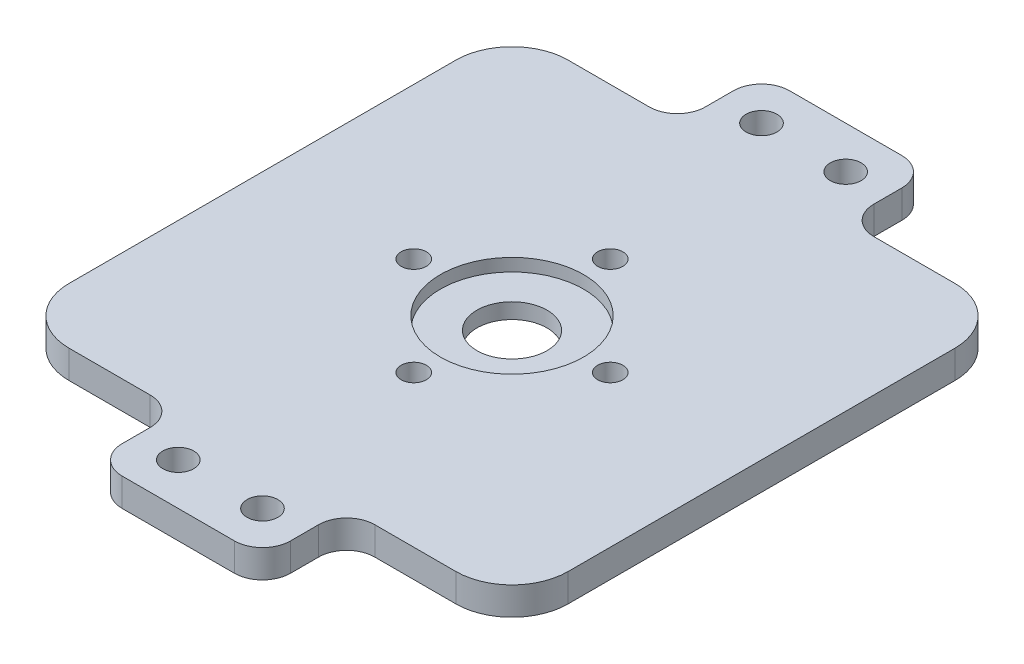
ISO-10303-21;
HEADER;
FILE_DESCRIPTION(('STEP AP214'),'2;1');
FILE_NAME('part.step','',(''),(''),'','','');
FILE_SCHEMA(('AUTOMOTIVE_DESIGN { 1 0 10303 214 1 1 1 1 }'));
ENDSEC;
DATA;
#1=APPLICATION_CONTEXT('core data for automotive mechanical design processes');
#2=APPLICATION_PROTOCOL_DEFINITION('international standard','automotive_design',2000,#1);
#3=PRODUCT_CONTEXT('',#1,'mechanical');
#4=PRODUCT('Part','Part','',(#3));
#5=PRODUCT_RELATED_PRODUCT_CATEGORY('part','',(#4));
#6=PRODUCT_DEFINITION_FORMATION('','',#4);
#7=PRODUCT_DEFINITION_CONTEXT('part definition',#1,'design');
#8=PRODUCT_DEFINITION('design','',#6,#7);
#9=PRODUCT_DEFINITION_SHAPE('','',#8);
#10=(LENGTH_UNIT() NAMED_UNIT(*) SI_UNIT(.MILLI.,.METRE.));
#11=(NAMED_UNIT(*) PLANE_ANGLE_UNIT() SI_UNIT($,.RADIAN.));
#12=(NAMED_UNIT(*) SI_UNIT($,.STERADIAN.) SOLID_ANGLE_UNIT());
#13=UNCERTAINTY_MEASURE_WITH_UNIT(LENGTH_MEASURE(1.E-05),#10,'distance_accuracy_value','');
#14=(GEOMETRIC_REPRESENTATION_CONTEXT(3) GLOBAL_UNCERTAINTY_ASSIGNED_CONTEXT((#13)) GLOBAL_UNIT_ASSIGNED_CONTEXT((#10,
#11,#12)) REPRESENTATION_CONTEXT('',''));
#15=CARTESIAN_POINT('',(0.,0.,0.));
#16=DIRECTION('',(0.,0.,1.));
#17=DIRECTION('',(1.,0.,0.));
#18=AXIS2_PLACEMENT_3D('',#15,#16,#17);
#19=CARTESIAN_POINT('',(44.45,5.,-44.45));
#20=DIRECTION('',(0.,-1.,0.));
#21=DIRECTION('',(0.,0.,-1.));
#22=AXIS2_PLACEMENT_3D('',#19,#20,#21);
#23=CYLINDRICAL_SURFACE('',#22,6.25);
#24=CARTESIAN_POINT('',(44.45,0.,-44.45));
#25=DIRECTION('',(0.,1.,0.));
#26=DIRECTION('',(0.,0.,1.));
#27=AXIS2_PLACEMENT_3D('',#24,#25,#26);
#28=CIRCLE('',#27,6.25);
#29=CARTESIAN_POINT('',(44.45,0.,-38.2));
#30=VERTEX_POINT('',#29);
#31=EDGE_CURVE('E251',#30,#30,#28,.T.);
#32=ORIENTED_EDGE('',*,*,#31,.F.);
#33=EDGE_LOOP('',(#32));
#34=FACE_BOUND('',#33,.T.);
#35=CARTESIAN_POINT('',(44.45,2.75,-44.45));
#36=DIRECTION('',(0.,1.,0.));
#37=DIRECTION('',(0.,0.,1.));
#38=AXIS2_PLACEMENT_3D('',#35,#36,#37);
#39=CIRCLE('',#38,6.25);
#40=CARTESIAN_POINT('',(44.45,2.75,-38.2));
#41=VERTEX_POINT('',#40);
#42=EDGE_CURVE('E49',#41,#41,#39,.T.);
#43=ORIENTED_EDGE('',*,*,#42,.T.);
#44=EDGE_LOOP('',(#43));
#45=FACE_BOUND('',#44,.T.);
#46=ADVANCED_FACE('F45',(#34,#45),#23,.F.);
#47=CARTESIAN_POINT('',(0.,5.,15.));
#48=DIRECTION('',(0.,0.,1.));
#49=DIRECTION('',(1.,0.,0.));
#50=AXIS2_PLACEMENT_3D('',#47,#48,#49);
#51=PLANE('',#50);
#52=DIRECTION('',(-1.,0.,0.));
#53=VECTOR('',#52,1.);
#54=CARTESIAN_POINT('',(0.,5.,15.));
#55=LINE('',#54,#53);
#56=CARTESIAN_POINT('',(54.45,5.,15.));
#57=VERTEX_POINT('',#56);
#58=CARTESIAN_POINT('',(34.45,5.,15.));
#59=VERTEX_POINT('',#58);
#60=EDGE_CURVE('E420',#57,#59,#55,.T.);
#61=ORIENTED_EDGE('',*,*,#60,.T.);
#62=DIRECTION('',(0.,-1.,0.));
#63=VECTOR('',#62,1.);
#64=CARTESIAN_POINT('',(34.45,0.,15.));
#65=LINE('',#64,#63);
#66=CARTESIAN_POINT('',(34.45,0.,15.));
#67=VERTEX_POINT('',#66);
#68=EDGE_CURVE('E348',#59,#67,#65,.T.);
#69=ORIENTED_EDGE('',*,*,#68,.T.);
#70=DIRECTION('',(-1.,0.,0.));
#71=VECTOR('',#70,1.);
#72=CARTESIAN_POINT('',(0.,0.,15.));
#73=LINE('',#72,#71);
#74=CARTESIAN_POINT('',(54.45,0.,15.));
#75=VERTEX_POINT('',#74);
#76=EDGE_CURVE('E403',#75,#67,#73,.T.);
#77=ORIENTED_EDGE('',*,*,#76,.F.);
#78=DIRECTION('',(0.,-1.,0.));
#79=VECTOR('',#78,1.);
#80=CARTESIAN_POINT('',(54.45,5.,15.));
#81=LINE('',#80,#79);
#82=EDGE_CURVE('E345',#75,#57,#81,.F.);
#83=ORIENTED_EDGE('',*,*,#82,.T.);
#84=EDGE_LOOP('',(#61,#69,#77,#83));
#85=FACE_BOUND('',#84,.T.);
#86=ADVANCED_FACE('F564',(#85),#51,.T.);
#87=CARTESIAN_POINT('',(59.45,5.,0.));
#88=DIRECTION('',(1.,0.,0.));
#89=DIRECTION('',(0.,0.,-1.));
#90=AXIS2_PLACEMENT_3D('',#87,#88,#89);
#91=PLANE('',#90);
#92=DIRECTION('',(0.,0.,1.));
#93=VECTOR('',#92,1.);
#94=CARTESIAN_POINT('',(59.45,0.,0.));
#95=LINE('',#94,#93);
#96=CARTESIAN_POINT('',(59.45,0.,5.));
#97=VERTEX_POINT('',#96);
#98=CARTESIAN_POINT('',(59.45,0.,10.));
#99=VERTEX_POINT('',#98);
#100=EDGE_CURVE('E394',#97,#99,#95,.T.);
#101=ORIENTED_EDGE('',*,*,#100,.F.);
#102=DIRECTION('',(0.,-1.,0.));
#103=VECTOR('',#102,1.);
#104=CARTESIAN_POINT('',(59.45,5.,5.));
#105=LINE('',#104,#103);
#106=CARTESIAN_POINT('',(59.45,5.,5.));
#107=VERTEX_POINT('',#106);
#108=EDGE_CURVE('E370',#97,#107,#105,.F.);
#109=ORIENTED_EDGE('',*,*,#108,.T.);
#110=DIRECTION('',(0.,0.,1.));
#111=VECTOR('',#110,1.);
#112=CARTESIAN_POINT('',(59.45,5.,0.));
#113=LINE('',#112,#111);
#114=CARTESIAN_POINT('',(59.45,5.,10.));
#115=VERTEX_POINT('',#114);
#116=EDGE_CURVE('E413',#107,#115,#113,.T.);
#117=ORIENTED_EDGE('',*,*,#116,.T.);
#118=DIRECTION('',(0.,-1.,0.));
#119=VECTOR('',#118,1.);
#120=CARTESIAN_POINT('',(59.45,5.,10.));
#121=LINE('',#120,#119);
#122=EDGE_CURVE('E366',#115,#99,#121,.T.);
#123=ORIENTED_EDGE('',*,*,#122,.T.);
#124=EDGE_LOOP('',(#101,#109,#117,#123));
#125=FACE_BOUND('',#124,.T.);
#126=ADVANCED_FACE('F400',(#125),#91,.T.);
#127=CARTESIAN_POINT('',(0.,5.,0.));
#128=DIRECTION('',(0.,0.,-1.));
#129=DIRECTION('',(-1.,0.,0.));
#130=AXIS2_PLACEMENT_3D('',#127,#128,#129);
#131=PLANE('',#130);
#132=DIRECTION('',(1.,0.,0.));
#133=VECTOR('',#132,1.);
#134=CARTESIAN_POINT('',(0.,5.,0.));
#135=LINE('',#134,#133);
#136=CARTESIAN_POINT('',(64.45,5.,0.));
#137=VERTEX_POINT('',#136);
#138=CARTESIAN_POINT('',(78.9,5.,0.));
#139=VERTEX_POINT('',#138);
#140=EDGE_CURVE('E408',#137,#139,#135,.T.);
#141=ORIENTED_EDGE('',*,*,#140,.F.);
#142=DIRECTION('',(0.,-1.,0.));
#143=VECTOR('',#142,1.);
#144=CARTESIAN_POINT('',(64.45,5.,0.));
#145=LINE('',#144,#143);
#146=CARTESIAN_POINT('',(64.45,0.,0.));
#147=VERTEX_POINT('',#146);
#148=EDGE_CURVE('E362',#137,#147,#145,.T.);
#149=ORIENTED_EDGE('',*,*,#148,.T.);
#150=DIRECTION('',(1.,0.,0.));
#151=VECTOR('',#150,1.);
#152=CARTESIAN_POINT('',(0.,0.,0.));
#153=LINE('',#152,#151);
#154=CARTESIAN_POINT('',(78.9,0.,0.));
#155=VERTEX_POINT('',#154);
#156=EDGE_CURVE('E395',#147,#155,#153,.T.);
#157=ORIENTED_EDGE('',*,*,#156,.T.);
#158=DIRECTION('',(0.,-1.,0.));
#159=VECTOR('',#158,1.);
#160=CARTESIAN_POINT('',(78.9,5.,0.));
#161=LINE('',#160,#159);
#162=EDGE_CURVE('E276',#155,#139,#161,.F.);
#163=ORIENTED_EDGE('',*,*,#162,.T.);
#164=EDGE_LOOP('',(#141,#149,#157,#163));
#165=FACE_BOUND('',#164,.T.);
#166=ADVANCED_FACE('F407',(#165),#131,.F.);
#167=CARTESIAN_POINT('',(88.9,5.,0.));
#168=DIRECTION('',(-1.,0.,0.));
#169=DIRECTION('',(0.,0.,1.));
#170=AXIS2_PLACEMENT_3D('',#167,#168,#169);
#171=PLANE('',#170);
#172=DIRECTION('',(0.,0.,-1.));
#173=VECTOR('',#172,1.);
#174=CARTESIAN_POINT('',(88.9,0.,0.));
#175=LINE('',#174,#173);
#176=CARTESIAN_POINT('',(88.9,0.,-10.));
#177=VERTEX_POINT('',#176);
#178=CARTESIAN_POINT('',(88.9,0.,-78.9));
#179=VERTEX_POINT('',#178);
#180=EDGE_CURVE('E221',#177,#179,#175,.T.);
#181=ORIENTED_EDGE('',*,*,#180,.T.);
#182=DIRECTION('',(0.,-1.,0.));
#183=VECTOR('',#182,1.);
#184=CARTESIAN_POINT('',(88.9,5.,-78.9));
#185=LINE('',#184,#183);
#186=CARTESIAN_POINT('',(88.9,5.,-78.9));
#187=VERTEX_POINT('',#186);
#188=EDGE_CURVE('E230',#179,#187,#185,.F.);
#189=ORIENTED_EDGE('',*,*,#188,.T.);
#190=DIRECTION('',(0.,0.,-1.));
#191=VECTOR('',#190,1.);
#192=CARTESIAN_POINT('',(88.9,5.,0.));
#193=LINE('',#192,#191);
#194=CARTESIAN_POINT('',(88.9,5.,-10.));
#195=VERTEX_POINT('',#194);
#196=EDGE_CURVE('E412',#195,#187,#193,.T.);
#197=ORIENTED_EDGE('',*,*,#196,.F.);
#198=DIRECTION('',(0.,-1.,0.));
#199=VECTOR('',#198,1.);
#200=CARTESIAN_POINT('',(88.9,5.,-10.));
#201=LINE('',#200,#199);
#202=EDGE_CURVE('E232',#195,#177,#201,.T.);
#203=ORIENTED_EDGE('',*,*,#202,.T.);
#204=EDGE_LOOP('',(#181,#189,#197,#203));
#205=FACE_BOUND('',#204,.T.);
#206=ADVANCED_FACE('F636',(#205),#171,.F.);
#207=CARTESIAN_POINT('',(0.,5.,-88.9));
#208=DIRECTION('',(0.,0.,-1.));
#209=DIRECTION('',(-1.,0.,0.));
#210=AXIS2_PLACEMENT_3D('',#207,#208,#209);
#211=PLANE('',#210);
#212=DIRECTION('',(1.,0.,0.));
#213=VECTOR('',#212,1.);
#214=CARTESIAN_POINT('',(0.,0.,-88.9));
#215=LINE('',#214,#213);
#216=CARTESIAN_POINT('',(64.45,0.,-88.9));
#217=VERTEX_POINT('',#216);
#218=CARTESIAN_POINT('',(78.9,0.,-88.9));
#219=VERTEX_POINT('',#218);
#220=EDGE_CURVE('E206',#217,#219,#215,.T.);
#221=ORIENTED_EDGE('',*,*,#220,.F.);
#222=DIRECTION('',(0.,-1.,0.));
#223=VECTOR('',#222,1.);
#224=CARTESIAN_POINT('',(64.45,5.,-88.9));
#225=LINE('',#224,#223);
#226=CARTESIAN_POINT('',(64.45,5.,-88.9));
#227=VERTEX_POINT('',#226);
#228=EDGE_CURVE('E342',#217,#227,#225,.F.);
#229=ORIENTED_EDGE('',*,*,#228,.T.);
#230=DIRECTION('',(1.,0.,0.));
#231=VECTOR('',#230,1.);
#232=CARTESIAN_POINT('',(0.,5.,-88.9));
#233=LINE('',#232,#231);
#234=CARTESIAN_POINT('',(78.9,5.,-88.9));
#235=VERTEX_POINT('',#234);
#236=EDGE_CURVE('E237',#227,#235,#233,.T.);
#237=ORIENTED_EDGE('',*,*,#236,.T.);
#238=DIRECTION('',(0.,-1.,0.));
#239=VECTOR('',#238,1.);
#240=CARTESIAN_POINT('',(78.9,0.,-88.9));
#241=LINE('',#240,#239);
#242=EDGE_CURVE('E229',#235,#219,#241,.T.);
#243=ORIENTED_EDGE('',*,*,#242,.T.);
#244=EDGE_LOOP('',(#221,#229,#237,#243));
#245=FACE_BOUND('',#244,.T.);
#246=ADVANCED_FACE('F235',(#245),#211,.T.);
#247=CARTESIAN_POINT('',(59.45,5.,0.));
#248=DIRECTION('',(-1.,0.,0.));
#249=DIRECTION('',(0.,0.,1.));
#250=AXIS2_PLACEMENT_3D('',#247,#248,#249);
#251=PLANE('',#250);
#252=DIRECTION('',(0.,0.,-1.));
#253=VECTOR('',#252,1.);
#254=CARTESIAN_POINT('',(59.45,0.,0.));
#255=LINE('',#254,#253);
#256=CARTESIAN_POINT('',(59.45,0.,-93.9));
#257=VERTEX_POINT('',#256);
#258=CARTESIAN_POINT('',(59.45,0.,-98.9));
#259=VERTEX_POINT('',#258);
#260=EDGE_CURVE('E220',#257,#259,#255,.T.);
#261=ORIENTED_EDGE('',*,*,#260,.T.);
#262=DIRECTION('',(0.,-1.,0.));
#263=VECTOR('',#262,1.);
#264=CARTESIAN_POINT('',(59.45,5.,-98.9));
#265=LINE('',#264,#263);
#266=CARTESIAN_POINT('',(59.45,5.,-98.9));
#267=VERTEX_POINT('',#266);
#268=EDGE_CURVE('E339',#259,#267,#265,.F.);
#269=ORIENTED_EDGE('',*,*,#268,.T.);
#270=DIRECTION('',(0.,0.,-1.));
#271=VECTOR('',#270,1.);
#272=CARTESIAN_POINT('',(59.45,5.,0.));
#273=LINE('',#272,#271);
#274=CARTESIAN_POINT('',(59.45,5.,-93.9));
#275=VERTEX_POINT('',#274);
#276=EDGE_CURVE('E717',#275,#267,#273,.T.);
#277=ORIENTED_EDGE('',*,*,#276,.F.);
#278=DIRECTION('',(0.,-1.,0.));
#279=VECTOR('',#278,1.);
#280=CARTESIAN_POINT('',(59.45,5.,-93.9));
#281=LINE('',#280,#279);
#282=EDGE_CURVE('E335',#275,#257,#281,.T.);
#283=ORIENTED_EDGE('',*,*,#282,.T.);
#284=EDGE_LOOP('',(#261,#269,#277,#283));
#285=FACE_BOUND('',#284,.T.);
#286=ADVANCED_FACE('F631',(#285),#251,.F.);
#287=CARTESIAN_POINT('',(0.,5.,-103.9));
#288=DIRECTION('',(0.,0.,1.));
#289=DIRECTION('',(1.,0.,0.));
#290=AXIS2_PLACEMENT_3D('',#287,#288,#289);
#291=PLANE('',#290);
#292=DIRECTION('',(-1.,0.,0.));
#293=VECTOR('',#292,1.);
#294=CARTESIAN_POINT('',(0.,0.,-103.9));
#295=LINE('',#294,#293);
#296=CARTESIAN_POINT('',(54.45,0.,-103.9));
#297=VERTEX_POINT('',#296);
#298=CARTESIAN_POINT('',(34.45,0.,-103.9));
#299=VERTEX_POINT('',#298);
#300=EDGE_CURVE('E483',#297,#299,#295,.T.);
#301=ORIENTED_EDGE('',*,*,#300,.T.);
#302=DIRECTION('',(0.,-1.,0.));
#303=VECTOR('',#302,1.);
#304=CARTESIAN_POINT('',(34.45,5.,-103.9));
#305=LINE('',#304,#303);
#306=CARTESIAN_POINT('',(34.45,5.,-103.9));
#307=VERTEX_POINT('',#306);
#308=EDGE_CURVE('E317',#299,#307,#305,.F.);
#309=ORIENTED_EDGE('',*,*,#308,.T.);
#310=DIRECTION('',(-1.,0.,0.));
#311=VECTOR('',#310,1.);
#312=CARTESIAN_POINT('',(0.,5.,-103.9));
#313=LINE('',#312,#311);
#314=CARTESIAN_POINT('',(54.45,5.,-103.9));
#315=VERTEX_POINT('',#314);
#316=EDGE_CURVE('E715',#315,#307,#313,.T.);
#317=ORIENTED_EDGE('',*,*,#316,.F.);
#318=DIRECTION('',(0.,-1.,0.));
#319=VECTOR('',#318,1.);
#320=CARTESIAN_POINT('',(54.45,5.,-103.9));
#321=LINE('',#320,#319);
#322=EDGE_CURVE('E313',#315,#297,#321,.T.);
#323=ORIENTED_EDGE('',*,*,#322,.T.);
#324=EDGE_LOOP('',(#301,#309,#317,#323));
#325=FACE_BOUND('',#324,.T.);
#326=ADVANCED_FACE('F627',(#325),#291,.F.);
#327=CARTESIAN_POINT('',(29.45,5.,0.));
#328=DIRECTION('',(-1.,0.,0.));
#329=DIRECTION('',(0.,0.,1.));
#330=AXIS2_PLACEMENT_3D('',#327,#328,#329);
#331=PLANE('',#330);
#332=DIRECTION('',(0.,0.,-1.));
#333=VECTOR('',#332,1.);
#334=CARTESIAN_POINT('',(29.45,5.,0.));
#335=LINE('',#334,#333);
#336=CARTESIAN_POINT('',(29.45,5.,-93.9));
#337=VERTEX_POINT('',#336);
#338=CARTESIAN_POINT('',(29.45,5.,-98.9));
#339=VERTEX_POINT('',#338);
#340=EDGE_CURVE('E441',#337,#339,#335,.T.);
#341=ORIENTED_EDGE('',*,*,#340,.T.);
#342=DIRECTION('',(0.,-1.,0.));
#343=VECTOR('',#342,1.);
#344=CARTESIAN_POINT('',(29.45,0.,-98.9));
#345=LINE('',#344,#343);
#346=CARTESIAN_POINT('',(29.45,0.,-98.9));
#347=VERTEX_POINT('',#346);
#348=EDGE_CURVE('E297',#339,#347,#345,.T.);
#349=ORIENTED_EDGE('',*,*,#348,.T.);
#350=DIRECTION('',(0.,0.,-1.));
#351=VECTOR('',#350,1.);
#352=CARTESIAN_POINT('',(29.45,0.,0.));
#353=LINE('',#352,#351);
#354=CARTESIAN_POINT('',(29.45,0.,-93.9));
#355=VERTEX_POINT('',#354);
#356=EDGE_CURVE('E487',#355,#347,#353,.T.);
#357=ORIENTED_EDGE('',*,*,#356,.F.);
#358=DIRECTION('',(0.,-1.,0.));
#359=VECTOR('',#358,1.);
#360=CARTESIAN_POINT('',(29.45,5.,-93.9));
#361=LINE('',#360,#359);
#362=EDGE_CURVE('E294',#355,#337,#361,.F.);
#363=ORIENTED_EDGE('',*,*,#362,.T.);
#364=EDGE_LOOP('',(#341,#349,#357,#363));
#365=FACE_BOUND('',#364,.T.);
#366=ADVANCED_FACE('F623',(#365),#331,.T.);
#367=CARTESIAN_POINT('',(10.,5.,-88.9));
#368=VERTEX_POINT('',#367);
#369=CARTESIAN_POINT('',(24.45,5.,-88.9));
#370=VERTEX_POINT('',#369);
#371=EDGE_CURVE('E434',#368,#370,#233,.T.);
#372=ORIENTED_EDGE('',*,*,#371,.T.);
#373=DIRECTION('',(0.,-1.,0.));
#374=VECTOR('',#373,1.);
#375=CARTESIAN_POINT('',(24.45,0.,-88.9));
#376=LINE('',#375,#374);
#377=CARTESIAN_POINT('',(24.45,0.,-88.9));
#378=VERTEX_POINT('',#377);
#379=EDGE_CURVE('E331',#370,#378,#376,.T.);
#380=ORIENTED_EDGE('',*,*,#379,.T.);
#381=CARTESIAN_POINT('',(10.,0.,-88.9));
#382=VERTEX_POINT('',#381);
#383=EDGE_CURVE('E223',#382,#378,#215,.T.);
#384=ORIENTED_EDGE('',*,*,#383,.F.);
#385=DIRECTION('',(0.,-1.,0.));
#386=VECTOR('',#385,1.);
#387=CARTESIAN_POINT('',(10.,5.,-88.9));
#388=LINE('',#387,#386);
#389=EDGE_CURVE('E291',#382,#368,#388,.F.);
#390=ORIENTED_EDGE('',*,*,#389,.T.);
#391=EDGE_LOOP('',(#372,#380,#384,#390));
#392=FACE_BOUND('',#391,.T.);
#393=ADVANCED_FACE('F620',(#392),#211,.T.);
#394=CARTESIAN_POINT('',(0.,5.,0.));
#395=DIRECTION('',(-1.,0.,0.));
#396=DIRECTION('',(0.,0.,1.));
#397=AXIS2_PLACEMENT_3D('',#394,#395,#396);
#398=PLANE('',#397);
#399=DIRECTION('',(0.,0.,-1.));
#400=VECTOR('',#399,1.);
#401=CARTESIAN_POINT('',(0.,0.,0.));
#402=LINE('',#401,#400);
#403=CARTESIAN_POINT('',(0.,0.,-10.));
#404=VERTEX_POINT('',#403);
#405=CARTESIAN_POINT('',(0.,0.,-78.9));
#406=VERTEX_POINT('',#405);
#407=EDGE_CURVE('E490',#404,#406,#402,.T.);
#408=ORIENTED_EDGE('',*,*,#407,.F.);
#409=DIRECTION('',(0.,-1.,0.));
#410=VECTOR('',#409,1.);
#411=CARTESIAN_POINT('',(0.,5.,-10.));
#412=LINE('',#411,#410);
#413=CARTESIAN_POINT('',(0.,5.,-10.));
#414=VERTEX_POINT('',#413);
#415=EDGE_CURVE('E288',#404,#414,#412,.F.);
#416=ORIENTED_EDGE('',*,*,#415,.T.);
#417=DIRECTION('',(0.,0.,-1.));
#418=VECTOR('',#417,1.);
#419=CARTESIAN_POINT('',(0.,5.,0.));
#420=LINE('',#419,#418);
#421=CARTESIAN_POINT('',(0.,5.,-78.9));
#422=VERTEX_POINT('',#421);
#423=EDGE_CURVE('E425',#414,#422,#420,.T.);
#424=ORIENTED_EDGE('',*,*,#423,.T.);
#425=DIRECTION('',(0.,-1.,0.));
#426=VECTOR('',#425,1.);
#427=CARTESIAN_POINT('',(0.,5.,-78.9));
#428=LINE('',#427,#426);
#429=EDGE_CURVE('E284',#422,#406,#428,.T.);
#430=ORIENTED_EDGE('',*,*,#429,.T.);
#431=EDGE_LOOP('',(#408,#416,#424,#430));
#432=FACE_BOUND('',#431,.T.);
#433=ADVANCED_FACE('F616',(#432),#398,.T.);
#434=CARTESIAN_POINT('',(10.,0.,0.));
#435=VERTEX_POINT('',#434);
#436=CARTESIAN_POINT('',(24.45,0.,0.));
#437=VERTEX_POINT('',#436);
#438=EDGE_CURVE('E477',#435,#437,#153,.T.);
#439=ORIENTED_EDGE('',*,*,#438,.T.);
#440=DIRECTION('',(0.,-1.,0.));
#441=VECTOR('',#440,1.);
#442=CARTESIAN_POINT('',(24.45,5.,0.));
#443=LINE('',#442,#441);
#444=CARTESIAN_POINT('',(24.45,5.,0.));
#445=VERTEX_POINT('',#444);
#446=EDGE_CURVE('E359',#437,#445,#443,.F.);
#447=ORIENTED_EDGE('',*,*,#446,.T.);
#448=CARTESIAN_POINT('',(10.,5.,0.));
#449=VERTEX_POINT('',#448);
#450=EDGE_CURVE('E415',#449,#445,#135,.T.);
#451=ORIENTED_EDGE('',*,*,#450,.F.);
#452=DIRECTION('',(0.,-1.,0.));
#453=VECTOR('',#452,1.);
#454=CARTESIAN_POINT('',(10.,0.,0.));
#455=LINE('',#454,#453);
#456=EDGE_CURVE('E280',#449,#435,#455,.T.);
#457=ORIENTED_EDGE('',*,*,#456,.T.);
#458=EDGE_LOOP('',(#439,#447,#451,#457));
#459=FACE_BOUND('',#458,.T.);
#460=ADVANCED_FACE('F580',(#459),#131,.F.);
#461=CARTESIAN_POINT('',(36.95,5.,7.5));
#462=DIRECTION('',(0.,-1.,0.));
#463=DIRECTION('',(0.,0.,-1.));
#464=AXIS2_PLACEMENT_3D('',#461,#462,#463);
#465=CYLINDRICAL_SURFACE('',#464,2.75);
#466=CARTESIAN_POINT('',(36.95,5.,7.5));
#467=DIRECTION('',(0.,1.,0.));
#468=DIRECTION('',(0.,0.,1.));
#469=AXIS2_PLACEMENT_3D('',#466,#467,#468);
#470=CIRCLE('',#469,2.75);
#471=CARTESIAN_POINT('',(36.95,5.,10.25));
#472=VERTEX_POINT('',#471);
#473=EDGE_CURVE('E241',#472,#472,#470,.T.);
#474=ORIENTED_EDGE('',*,*,#473,.T.);
#475=EDGE_LOOP('',(#474));
#476=FACE_BOUND('',#475,.T.);
#477=CARTESIAN_POINT('',(36.95,0.,7.5));
#478=DIRECTION('',(0.,1.,0.));
#479=DIRECTION('',(0.,0.,1.));
#480=AXIS2_PLACEMENT_3D('',#477,#478,#479);
#481=CIRCLE('',#480,2.75);
#482=CARTESIAN_POINT('',(36.95,0.,10.25));
#483=VERTEX_POINT('',#482);
#484=EDGE_CURVE('E525',#483,#483,#481,.T.);
#485=ORIENTED_EDGE('',*,*,#484,.F.);
#486=EDGE_LOOP('',(#485));
#487=FACE_BOUND('',#486,.T.);
#488=ADVANCED_FACE('F576',(#476,#487),#465,.F.);
#489=CARTESIAN_POINT('',(51.95,5.,7.5));
#490=DIRECTION('',(0.,-1.,0.));
#491=DIRECTION('',(0.,0.,-1.));
#492=AXIS2_PLACEMENT_3D('',#489,#490,#491);
#493=CYLINDRICAL_SURFACE('',#492,2.75);
#494=CARTESIAN_POINT('',(51.95,5.,7.5));
#495=DIRECTION('',(0.,1.,0.));
#496=DIRECTION('',(0.,0.,1.));
#497=AXIS2_PLACEMENT_3D('',#494,#495,#496);
#498=CIRCLE('',#497,2.75);
#499=CARTESIAN_POINT('',(51.95,5.,10.25));
#500=VERTEX_POINT('',#499);
#501=EDGE_CURVE('E248',#500,#500,#498,.T.);
#502=ORIENTED_EDGE('',*,*,#501,.T.);
#503=EDGE_LOOP('',(#502));
#504=FACE_BOUND('',#503,.T.);
#505=CARTESIAN_POINT('',(51.95,0.,7.5));
#506=DIRECTION('',(0.,1.,0.));
#507=DIRECTION('',(0.,0.,1.));
#508=AXIS2_PLACEMENT_3D('',#505,#506,#507);
#509=CIRCLE('',#508,2.75);
#510=CARTESIAN_POINT('',(51.95,0.,10.25));
#511=VERTEX_POINT('',#510);
#512=EDGE_CURVE('E522',#511,#511,#509,.T.);
#513=ORIENTED_EDGE('',*,*,#512,.F.);
#514=EDGE_LOOP('',(#513));
#515=FACE_BOUND('',#514,.T.);
#516=ADVANCED_FACE('F579',(#504,#515),#493,.F.);
#517=CARTESIAN_POINT('',(36.95,5.,-96.4));
#518=DIRECTION('',(0.,-1.,0.));
#519=DIRECTION('',(0.,0.,-1.));
#520=AXIS2_PLACEMENT_3D('',#517,#518,#519);
#521=CYLINDRICAL_SURFACE('',#520,2.75);
#522=CARTESIAN_POINT('',(36.95,5.,-96.4));
#523=DIRECTION('',(0.,1.,0.));
#524=DIRECTION('',(0.,0.,1.));
#525=AXIS2_PLACEMENT_3D('',#522,#523,#524);
#526=CIRCLE('',#525,2.75);
#527=CARTESIAN_POINT('',(36.95,5.,-93.65));
#528=VERTEX_POINT('',#527);
#529=EDGE_CURVE('E465',#528,#528,#526,.T.);
#530=ORIENTED_EDGE('',*,*,#529,.T.);
#531=EDGE_LOOP('',(#530));
#532=FACE_BOUND('',#531,.T.);
#533=CARTESIAN_POINT('',(36.95,0.,-96.4));
#534=DIRECTION('',(0.,1.,0.));
#535=DIRECTION('',(0.,0.,1.));
#536=AXIS2_PLACEMENT_3D('',#533,#534,#535);
#537=CIRCLE('',#536,2.75);
#538=CARTESIAN_POINT('',(36.95,0.,-93.65));
#539=VERTEX_POINT('',#538);
#540=EDGE_CURVE('E518',#539,#539,#537,.T.);
#541=ORIENTED_EDGE('',*,*,#540,.F.);
#542=EDGE_LOOP('',(#541));
#543=FACE_BOUND('',#542,.T.);
#544=ADVANCED_FACE('F584',(#532,#543),#521,.F.);
#545=CARTESIAN_POINT('',(51.95,5.,-96.4));
#546=DIRECTION('',(0.,-1.,0.));
#547=DIRECTION('',(0.,0.,-1.));
#548=AXIS2_PLACEMENT_3D('',#545,#546,#547);
#549=CYLINDRICAL_SURFACE('',#548,2.75);
#550=CARTESIAN_POINT('',(51.95,5.,-96.4));
#551=DIRECTION('',(0.,1.,0.));
#552=DIRECTION('',(0.,0.,1.));
#553=AXIS2_PLACEMENT_3D('',#550,#551,#552);
#554=CIRCLE('',#553,2.75);
#555=CARTESIAN_POINT('',(51.95,5.,-93.65));
#556=VERTEX_POINT('',#555);
#557=EDGE_CURVE('E461',#556,#556,#554,.T.);
#558=ORIENTED_EDGE('',*,*,#557,.T.);
#559=EDGE_LOOP('',(#558));
#560=FACE_BOUND('',#559,.T.);
#561=CARTESIAN_POINT('',(51.95,0.,-96.4));
#562=DIRECTION('',(0.,1.,0.));
#563=DIRECTION('',(0.,0.,1.));
#564=AXIS2_PLACEMENT_3D('',#561,#562,#563);
#565=CIRCLE('',#564,2.75);
#566=CARTESIAN_POINT('',(51.95,0.,-93.65));
#567=VERTEX_POINT('',#566);
#568=EDGE_CURVE('E514',#567,#567,#565,.T.);
#569=ORIENTED_EDGE('',*,*,#568,.F.);
#570=EDGE_LOOP('',(#569));
#571=FACE_BOUND('',#570,.T.);
#572=ADVANCED_FACE('F588',(#560,#571),#549,.F.);
#573=CARTESIAN_POINT('',(61.95,5.,-44.45));
#574=DIRECTION('',(0.,-1.,0.));
#575=DIRECTION('',(0.,0.,-1.));
#576=AXIS2_PLACEMENT_3D('',#573,#574,#575);
#577=CYLINDRICAL_SURFACE('',#576,2.25);
#578=CARTESIAN_POINT('',(61.95,5.,-44.45));
#579=DIRECTION('',(0.,1.,0.));
#580=DIRECTION('',(0.,0.,1.));
#581=AXIS2_PLACEMENT_3D('',#578,#579,#580);
#582=CIRCLE('',#581,2.25);
#583=CARTESIAN_POINT('',(61.95,5.,-42.2));
#584=VERTEX_POINT('',#583);
#585=EDGE_CURVE('E457',#584,#584,#582,.T.);
#586=ORIENTED_EDGE('',*,*,#585,.T.);
#587=EDGE_LOOP('',(#586));
#588=FACE_BOUND('',#587,.T.);
#589=CARTESIAN_POINT('',(61.95,0.,-44.45));
#590=DIRECTION('',(0.,1.,0.));
#591=DIRECTION('',(0.,0.,1.));
#592=AXIS2_PLACEMENT_3D('',#589,#590,#591);
#593=CIRCLE('',#592,2.25);
#594=CARTESIAN_POINT('',(61.95,0.,-42.2));
#595=VERTEX_POINT('',#594);
#596=EDGE_CURVE('E510',#595,#595,#593,.T.);
#597=ORIENTED_EDGE('',*,*,#596,.F.);
#598=EDGE_LOOP('',(#597));
#599=FACE_BOUND('',#598,.T.);
#600=ADVANCED_FACE('F592',(#588,#599),#577,.F.);
#601=CARTESIAN_POINT('',(44.45,5.,-61.95));
#602=DIRECTION('',(0.,-1.,0.));
#603=DIRECTION('',(0.,0.,-1.));
#604=AXIS2_PLACEMENT_3D('',#601,#602,#603);
#605=CYLINDRICAL_SURFACE('',#604,2.25);
#606=CARTESIAN_POINT('',(44.45,5.,-61.95));
#607=DIRECTION('',(0.,1.,0.));
#608=DIRECTION('',(0.,0.,1.));
#609=AXIS2_PLACEMENT_3D('',#606,#607,#608);
#610=CIRCLE('',#609,2.25);
#611=CARTESIAN_POINT('',(44.45,5.,-59.7));
#612=VERTEX_POINT('',#611);
#613=EDGE_CURVE('E453',#612,#612,#610,.T.);
#614=ORIENTED_EDGE('',*,*,#613,.T.);
#615=EDGE_LOOP('',(#614));
#616=FACE_BOUND('',#615,.T.);
#617=CARTESIAN_POINT('',(44.45,0.,-61.95));
#618=DIRECTION('',(0.,1.,0.));
#619=DIRECTION('',(0.,0.,1.));
#620=AXIS2_PLACEMENT_3D('',#617,#618,#619);
#621=CIRCLE('',#620,2.25);
#622=CARTESIAN_POINT('',(44.45,0.,-59.7));
#623=VERTEX_POINT('',#622);
#624=EDGE_CURVE('E506',#623,#623,#621,.T.);
#625=ORIENTED_EDGE('',*,*,#624,.F.);
#626=EDGE_LOOP('',(#625));
#627=FACE_BOUND('',#626,.T.);
#628=ADVANCED_FACE('F596',(#616,#627),#605,.F.);
#629=CARTESIAN_POINT('',(26.95,5.,-44.45));
#630=DIRECTION('',(0.,-1.,0.));
#631=DIRECTION('',(0.,0.,-1.));
#632=AXIS2_PLACEMENT_3D('',#629,#630,#631);
#633=CYLINDRICAL_SURFACE('',#632,2.25);
#634=CARTESIAN_POINT('',(26.95,5.,-44.45));
#635=DIRECTION('',(0.,1.,0.));
#636=DIRECTION('',(0.,0.,1.));
#637=AXIS2_PLACEMENT_3D('',#634,#635,#636);
#638=CIRCLE('',#637,2.25);
#639=CARTESIAN_POINT('',(26.95,5.,-42.2));
#640=VERTEX_POINT('',#639);
#641=EDGE_CURVE('E449',#640,#640,#638,.T.);
#642=ORIENTED_EDGE('',*,*,#641,.T.);
#643=EDGE_LOOP('',(#642));
#644=FACE_BOUND('',#643,.T.);
#645=CARTESIAN_POINT('',(26.95,0.,-44.45));
#646=DIRECTION('',(0.,1.,0.));
#647=DIRECTION('',(0.,0.,1.));
#648=AXIS2_PLACEMENT_3D('',#645,#646,#647);
#649=CIRCLE('',#648,2.25);
#650=CARTESIAN_POINT('',(26.95,0.,-42.2));
#651=VERTEX_POINT('',#650);
#652=EDGE_CURVE('E502',#651,#651,#649,.T.);
#653=ORIENTED_EDGE('',*,*,#652,.F.);
#654=EDGE_LOOP('',(#653));
#655=FACE_BOUND('',#654,.T.);
#656=ADVANCED_FACE('F600',(#644,#655),#633,.F.);
#657=CARTESIAN_POINT('',(44.45,5.,-26.95));
#658=DIRECTION('',(0.,-1.,0.));
#659=DIRECTION('',(0.,0.,-1.));
#660=AXIS2_PLACEMENT_3D('',#657,#658,#659);
#661=CYLINDRICAL_SURFACE('',#660,2.25);
#662=CARTESIAN_POINT('',(44.45,5.,-26.95));
#663=DIRECTION('',(0.,1.,0.));
#664=DIRECTION('',(0.,0.,1.));
#665=AXIS2_PLACEMENT_3D('',#662,#663,#664);
#666=CIRCLE('',#665,2.25);
#667=CARTESIAN_POINT('',(44.45,5.,-24.7));
#668=VERTEX_POINT('',#667);
#669=EDGE_CURVE('E431',#668,#668,#666,.T.);
#670=ORIENTED_EDGE('',*,*,#669,.T.);
#671=EDGE_LOOP('',(#670));
#672=FACE_BOUND('',#671,.T.);
#673=CARTESIAN_POINT('',(44.45,0.,-26.95));
#674=DIRECTION('',(0.,1.,0.));
#675=DIRECTION('',(0.,0.,1.));
#676=AXIS2_PLACEMENT_3D('',#673,#674,#675);
#677=CIRCLE('',#676,2.25);
#678=CARTESIAN_POINT('',(44.45,0.,-24.7));
#679=VERTEX_POINT('',#678);
#680=EDGE_CURVE('E498',#679,#679,#677,.T.);
#681=ORIENTED_EDGE('',*,*,#680,.F.);
#682=EDGE_LOOP('',(#681));
#683=FACE_BOUND('',#682,.T.);
#684=ADVANCED_FACE('F604',(#672,#683),#661,.F.);
#685=CARTESIAN_POINT('',(29.45,5.,0.));
#686=DIRECTION('',(1.,0.,0.));
#687=DIRECTION('',(0.,0.,-1.));
#688=AXIS2_PLACEMENT_3D('',#685,#686,#687);
#689=PLANE('',#688);
#690=DIRECTION('',(0.,0.,1.));
#691=VECTOR('',#690,1.);
#692=CARTESIAN_POINT('',(29.45,0.,0.));
#693=LINE('',#692,#691);
#694=CARTESIAN_POINT('',(29.45,0.,5.));
#695=VERTEX_POINT('',#694);
#696=CARTESIAN_POINT('',(29.45,0.,10.));
#697=VERTEX_POINT('',#696);
#698=EDGE_CURVE('E494',#695,#697,#693,.T.);
#699=ORIENTED_EDGE('',*,*,#698,.T.);
#700=DIRECTION('',(0.,-1.,0.));
#701=VECTOR('',#700,1.);
#702=CARTESIAN_POINT('',(29.45,5.,10.));
#703=LINE('',#702,#701);
#704=CARTESIAN_POINT('',(29.45,5.,10.));
#705=VERTEX_POINT('',#704);
#706=EDGE_CURVE('E356',#697,#705,#703,.F.);
#707=ORIENTED_EDGE('',*,*,#706,.T.);
#708=DIRECTION('',(0.,0.,1.));
#709=VECTOR('',#708,1.);
#710=CARTESIAN_POINT('',(29.45,5.,0.));
#711=LINE('',#710,#709);
#712=CARTESIAN_POINT('',(29.45,5.,5.));
#713=VERTEX_POINT('',#712);
#714=EDGE_CURVE('E424',#713,#705,#711,.T.);
#715=ORIENTED_EDGE('',*,*,#714,.F.);
#716=DIRECTION('',(0.,-1.,0.));
#717=VECTOR('',#716,1.);
#718=CARTESIAN_POINT('',(29.45,0.,5.));
#719=LINE('',#718,#717);
#720=EDGE_CURVE('E352',#713,#695,#719,.T.);
#721=ORIENTED_EDGE('',*,*,#720,.T.);
#722=EDGE_LOOP('',(#699,#707,#715,#721));
#723=FACE_BOUND('',#722,.T.);
#724=ADVANCED_FACE('F608',(#723),#689,.F.);
#725=CARTESIAN_POINT('',(0.,5.,0.));
#726=DIRECTION('',(0.,1.,0.));
#727=DIRECTION('',(0.,0.,1.));
#728=AXIS2_PLACEMENT_3D('',#725,#726,#727);
#729=PLANE('',#728);
#730=CARTESIAN_POINT('',(44.45,5.,-44.45));
#731=DIRECTION('',(0.,1.,0.));
#732=DIRECTION('',(0.,0.,1.));
#733=AXIS2_PLACEMENT_3D('',#730,#731,#732);
#734=CIRCLE('',#733,12.75);
#735=CARTESIAN_POINT('',(44.45,5.,-31.7));
#736=VERTEX_POINT('',#735);
#737=EDGE_CURVE('E540',#736,#736,#734,.T.);
#738=ORIENTED_EDGE('',*,*,#737,.F.);
#739=EDGE_LOOP('',(#738));
#740=FACE_BOUND('',#739,.T.);
#741=ORIENTED_EDGE('',*,*,#316,.T.);
#742=CARTESIAN_POINT('',(34.45,5.,-98.9));
#743=DIRECTION('',(0.,1.,0.));
#744=DIRECTION('',(0.,0.,1.));
#745=AXIS2_PLACEMENT_3D('',#742,#743,#744);
#746=CIRCLE('',#745,5.);
#747=EDGE_CURVE('E328',#307,#339,#746,.T.);
#748=ORIENTED_EDGE('',*,*,#747,.T.);
#749=ORIENTED_EDGE('',*,*,#340,.F.);
#750=CARTESIAN_POINT('',(24.45,5.,-93.9));
#751=DIRECTION('',(0.,1.,0.));
#752=DIRECTION('',(0.,0.,1.));
#753=AXIS2_PLACEMENT_3D('',#750,#751,#752);
#754=CIRCLE('',#753,5.);
#755=EDGE_CURVE('E376',#337,#370,#754,.F.);
#756=ORIENTED_EDGE('',*,*,#755,.T.);
#757=ORIENTED_EDGE('',*,*,#371,.F.);
#758=CARTESIAN_POINT('',(10.,5.,-78.9));
#759=DIRECTION('',(0.,1.,0.));
#760=DIRECTION('',(0.,0.,1.));
#761=AXIS2_PLACEMENT_3D('',#758,#759,#760);
#762=CIRCLE('',#761,10.);
#763=EDGE_CURVE('E264',#368,#422,#762,.T.);
#764=ORIENTED_EDGE('',*,*,#763,.T.);
#765=ORIENTED_EDGE('',*,*,#423,.F.);
#766=CARTESIAN_POINT('',(10.,5.,-10.));
#767=DIRECTION('',(0.,1.,0.));
#768=DIRECTION('',(0.,0.,1.));
#769=AXIS2_PLACEMENT_3D('',#766,#767,#768);
#770=CIRCLE('',#769,10.);
#771=EDGE_CURVE('E267',#414,#449,#770,.T.);
#772=ORIENTED_EDGE('',*,*,#771,.T.);
#773=ORIENTED_EDGE('',*,*,#450,.T.);
#774=CARTESIAN_POINT('',(24.45,5.,5.));
#775=DIRECTION('',(0.,1.,0.));
#776=DIRECTION('',(0.,0.,1.));
#777=AXIS2_PLACEMENT_3D('',#774,#775,#776);
#778=CIRCLE('',#777,5.);
#779=EDGE_CURVE('E387',#445,#713,#778,.F.);
#780=ORIENTED_EDGE('',*,*,#779,.T.);
#781=ORIENTED_EDGE('',*,*,#714,.T.);
#782=CARTESIAN_POINT('',(34.45,5.,10.));
#783=DIRECTION('',(0.,1.,0.));
#784=DIRECTION('',(0.,0.,1.));
#785=AXIS2_PLACEMENT_3D('',#782,#783,#784);
#786=CIRCLE('',#785,5.);
#787=EDGE_CURVE('E322',#705,#59,#786,.T.);
#788=ORIENTED_EDGE('',*,*,#787,.T.);
#789=ORIENTED_EDGE('',*,*,#60,.F.);
#790=CARTESIAN_POINT('',(54.45,5.,10.));
#791=DIRECTION('',(0.,1.,0.));
#792=DIRECTION('',(0.,0.,1.));
#793=AXIS2_PLACEMENT_3D('',#790,#791,#792);
#794=CIRCLE('',#793,5.);
#795=EDGE_CURVE('E66',#57,#115,#794,.T.);
#796=ORIENTED_EDGE('',*,*,#795,.T.);
#797=ORIENTED_EDGE('',*,*,#116,.F.);
#798=CARTESIAN_POINT('',(64.45,5.,5.));
#799=DIRECTION('',(0.,1.,0.));
#800=DIRECTION('',(0.,0.,1.));
#801=AXIS2_PLACEMENT_3D('',#798,#799,#800);
#802=CIRCLE('',#801,5.);
#803=EDGE_CURVE('E11',#107,#137,#802,.F.);
#804=ORIENTED_EDGE('',*,*,#803,.T.);
#805=ORIENTED_EDGE('',*,*,#140,.T.);
#806=CARTESIAN_POINT('',(78.9,5.,-10.));
#807=DIRECTION('',(0.,1.,0.));
#808=DIRECTION('',(0.,0.,1.));
#809=AXIS2_PLACEMENT_3D('',#806,#807,#808);
#810=CIRCLE('',#809,10.);
#811=EDGE_CURVE('E270',#139,#195,#810,.T.);
#812=ORIENTED_EDGE('',*,*,#811,.T.);
#813=ORIENTED_EDGE('',*,*,#196,.T.);
#814=CARTESIAN_POINT('',(78.9,5.,-78.9));
#815=DIRECTION('',(0.,1.,0.));
#816=DIRECTION('',(0.,0.,1.));
#817=AXIS2_PLACEMENT_3D('',#814,#815,#816);
#818=CIRCLE('',#817,10.);
#819=EDGE_CURVE('E273',#187,#235,#818,.T.);
#820=ORIENTED_EDGE('',*,*,#819,.T.);
#821=ORIENTED_EDGE('',*,*,#236,.F.);
#822=CARTESIAN_POINT('',(64.45,5.,-93.9));
#823=DIRECTION('',(0.,1.,0.));
#824=DIRECTION('',(0.,0.,1.));
#825=AXIS2_PLACEMENT_3D('',#822,#823,#824);
#826=CIRCLE('',#825,5.);
#827=EDGE_CURVE('E381',#227,#275,#826,.F.);
#828=ORIENTED_EDGE('',*,*,#827,.T.);
#829=ORIENTED_EDGE('',*,*,#276,.T.);
#830=CARTESIAN_POINT('',(54.45,5.,-98.9));
#831=DIRECTION('',(0.,1.,0.));
#832=DIRECTION('',(0.,0.,1.));
#833=AXIS2_PLACEMENT_3D('',#830,#831,#832);
#834=CIRCLE('',#833,5.);
#835=EDGE_CURVE('E325',#267,#315,#834,.T.);
#836=ORIENTED_EDGE('',*,*,#835,.T.);
#837=EDGE_LOOP('',(#741,#748,#749,#756,#757,#764,#765,#772,#773,#780,#781,#788,#789,#796,#797,
#804,#805,#812,#813,#820,#821,#828,#829,#836));
#838=FACE_BOUND('',#837,.T.);
#839=ORIENTED_EDGE('',*,*,#669,.F.);
#840=EDGE_LOOP('',(#839));
#841=FACE_BOUND('',#840,.T.);
#842=ORIENTED_EDGE('',*,*,#641,.F.);
#843=EDGE_LOOP('',(#842));
#844=FACE_BOUND('',#843,.T.);
#845=ORIENTED_EDGE('',*,*,#613,.F.);
#846=EDGE_LOOP('',(#845));
#847=FACE_BOUND('',#846,.T.);
#848=ORIENTED_EDGE('',*,*,#585,.F.);
#849=EDGE_LOOP('',(#848));
#850=FACE_BOUND('',#849,.T.);
#851=ORIENTED_EDGE('',*,*,#557,.F.);
#852=EDGE_LOOP('',(#851));
#853=FACE_BOUND('',#852,.T.);
#854=ORIENTED_EDGE('',*,*,#529,.F.);
#855=EDGE_LOOP('',(#854));
#856=FACE_BOUND('',#855,.T.);
#857=ORIENTED_EDGE('',*,*,#501,.F.);
#858=EDGE_LOOP('',(#857));
#859=FACE_BOUND('',#858,.T.);
#860=ORIENTED_EDGE('',*,*,#473,.F.);
#861=EDGE_LOOP('',(#860));
#862=FACE_BOUND('',#861,.T.);
#863=ADVANCED_FACE('F612',(#740,#838,#841,#844,#847,#850,#853,#856,#859,#862),#729,.T.);
#864=CARTESIAN_POINT('',(0.,0.,0.));
#865=DIRECTION('',(0.,1.,0.));
#866=DIRECTION('',(0.,0.,1.));
#867=AXIS2_PLACEMENT_3D('',#864,#865,#866);
#868=PLANE('',#867);
#869=ORIENTED_EDGE('',*,*,#356,.T.);
#870=CARTESIAN_POINT('',(34.45,0.,-98.9));
#871=DIRECTION('',(0.,1.,0.));
#872=DIRECTION('',(0.,0.,1.));
#873=AXIS2_PLACEMENT_3D('',#870,#871,#872);
#874=CIRCLE('',#873,5.);
#875=EDGE_CURVE('E310',#347,#299,#874,.F.);
#876=ORIENTED_EDGE('',*,*,#875,.T.);
#877=ORIENTED_EDGE('',*,*,#300,.F.);
#878=CARTESIAN_POINT('',(54.45,0.,-98.9));
#879=DIRECTION('',(0.,1.,0.));
#880=DIRECTION('',(0.,0.,1.));
#881=AXIS2_PLACEMENT_3D('',#878,#879,#880);
#882=CIRCLE('',#881,5.);
#883=EDGE_CURVE('E307',#297,#259,#882,.F.);
#884=ORIENTED_EDGE('',*,*,#883,.T.);
#885=ORIENTED_EDGE('',*,*,#260,.F.);
#886=CARTESIAN_POINT('',(64.45,0.,-93.9));
#887=DIRECTION('',(0.,1.,0.));
#888=DIRECTION('',(0.,0.,1.));
#889=AXIS2_PLACEMENT_3D('',#886,#887,#888);
#890=CIRCLE('',#889,5.);
#891=EDGE_CURVE('E215',#257,#217,#890,.T.);
#892=ORIENTED_EDGE('',*,*,#891,.T.);
#893=ORIENTED_EDGE('',*,*,#220,.T.);
#894=CARTESIAN_POINT('',(78.9,0.,-78.9));
#895=DIRECTION('',(0.,1.,0.));
#896=DIRECTION('',(0.,0.,1.));
#897=AXIS2_PLACEMENT_3D('',#894,#895,#896);
#898=CIRCLE('',#897,10.);
#899=EDGE_CURVE('E212',#219,#179,#898,.F.);
#900=ORIENTED_EDGE('',*,*,#899,.T.);
#901=ORIENTED_EDGE('',*,*,#180,.F.);
#902=CARTESIAN_POINT('',(78.9,0.,-10.));
#903=DIRECTION('',(0.,1.,0.));
#904=DIRECTION('',(0.,0.,1.));
#905=AXIS2_PLACEMENT_3D('',#902,#903,#904);
#906=CIRCLE('',#905,10.);
#907=EDGE_CURVE('E233',#177,#155,#906,.F.);
#908=ORIENTED_EDGE('',*,*,#907,.T.);
#909=ORIENTED_EDGE('',*,*,#156,.F.);
#910=CARTESIAN_POINT('',(64.45,0.,5.));
#911=DIRECTION('',(0.,1.,0.));
#912=DIRECTION('',(0.,0.,1.));
#913=AXIS2_PLACEMENT_3D('',#910,#911,#912);
#914=CIRCLE('',#913,5.);
#915=EDGE_CURVE('E55',#147,#97,#914,.T.);
#916=ORIENTED_EDGE('',*,*,#915,.T.);
#917=ORIENTED_EDGE('',*,*,#100,.T.);
#918=CARTESIAN_POINT('',(54.45,0.,10.));
#919=DIRECTION('',(0.,1.,0.));
#920=DIRECTION('',(0.,0.,1.));
#921=AXIS2_PLACEMENT_3D('',#918,#919,#920);
#922=CIRCLE('',#921,5.);
#923=EDGE_CURVE('E301',#99,#75,#922,.F.);
#924=ORIENTED_EDGE('',*,*,#923,.T.);
#925=ORIENTED_EDGE('',*,*,#76,.T.);
#926=CARTESIAN_POINT('',(34.45,0.,10.));
#927=DIRECTION('',(0.,1.,0.));
#928=DIRECTION('',(0.,0.,1.));
#929=AXIS2_PLACEMENT_3D('',#926,#927,#928);
#930=CIRCLE('',#929,5.);
#931=EDGE_CURVE('E304',#67,#697,#930,.F.);
#932=ORIENTED_EDGE('',*,*,#931,.T.);
#933=ORIENTED_EDGE('',*,*,#698,.F.);
#934=CARTESIAN_POINT('',(24.45,0.,5.));
#935=DIRECTION('',(0.,1.,0.));
#936=DIRECTION('',(0.,0.,1.));
#937=AXIS2_PLACEMENT_3D('',#934,#935,#936);
#938=CIRCLE('',#937,5.);
#939=EDGE_CURVE('E384',#695,#437,#938,.T.);
#940=ORIENTED_EDGE('',*,*,#939,.T.);
#941=ORIENTED_EDGE('',*,*,#438,.F.);
#942=CARTESIAN_POINT('',(10.,0.,-10.));
#943=DIRECTION('',(0.,1.,0.));
#944=DIRECTION('',(0.,0.,1.));
#945=AXIS2_PLACEMENT_3D('',#942,#943,#944);
#946=CIRCLE('',#945,10.);
#947=EDGE_CURVE('E245',#435,#404,#946,.F.);
#948=ORIENTED_EDGE('',*,*,#947,.T.);
#949=ORIENTED_EDGE('',*,*,#407,.T.);
#950=CARTESIAN_POINT('',(10.,0.,-78.9));
#951=DIRECTION('',(0.,1.,0.));
#952=DIRECTION('',(0.,0.,1.));
#953=AXIS2_PLACEMENT_3D('',#950,#951,#952);
#954=CIRCLE('',#953,10.);
#955=EDGE_CURVE('E240',#406,#382,#954,.F.);
#956=ORIENTED_EDGE('',*,*,#955,.T.);
#957=ORIENTED_EDGE('',*,*,#383,.T.);
#958=CARTESIAN_POINT('',(24.45,0.,-93.9));
#959=DIRECTION('',(0.,1.,0.));
#960=DIRECTION('',(0.,0.,1.));
#961=AXIS2_PLACEMENT_3D('',#958,#959,#960);
#962=CIRCLE('',#961,5.);
#963=EDGE_CURVE('E373',#378,#355,#962,.T.);
#964=ORIENTED_EDGE('',*,*,#963,.T.);
#965=EDGE_LOOP('',(#869,#876,#877,#884,#885,#892,#893,#900,#901,#908,#909,#916,#917,#924,#925,
#932,#933,#940,#941,#948,#949,#956,#957,#964));
#966=FACE_BOUND('',#965,.T.);
#967=ORIENTED_EDGE('',*,*,#680,.T.);
#968=EDGE_LOOP('',(#967));
#969=FACE_BOUND('',#968,.T.);
#970=ORIENTED_EDGE('',*,*,#652,.T.);
#971=EDGE_LOOP('',(#970));
#972=FACE_BOUND('',#971,.T.);
#973=ORIENTED_EDGE('',*,*,#624,.T.);
#974=EDGE_LOOP('',(#973));
#975=FACE_BOUND('',#974,.T.);
#976=ORIENTED_EDGE('',*,*,#596,.T.);
#977=EDGE_LOOP('',(#976));
#978=FACE_BOUND('',#977,.T.);
#979=ORIENTED_EDGE('',*,*,#568,.T.);
#980=EDGE_LOOP('',(#979));
#981=FACE_BOUND('',#980,.T.);
#982=ORIENTED_EDGE('',*,*,#540,.T.);
#983=EDGE_LOOP('',(#982));
#984=FACE_BOUND('',#983,.T.);
#985=ORIENTED_EDGE('',*,*,#512,.T.);
#986=EDGE_LOOP('',(#985));
#987=FACE_BOUND('',#986,.T.);
#988=ORIENTED_EDGE('',*,*,#484,.T.);
#989=EDGE_LOOP('',(#988));
#990=FACE_BOUND('',#989,.T.);
#991=ORIENTED_EDGE('',*,*,#31,.T.);
#992=EDGE_LOOP('',(#991));
#993=FACE_BOUND('',#992,.T.);
#994=ADVANCED_FACE('F209',(#966,#969,#972,#975,#978,#981,#984,#987,#990,#993),#868,.F.);
#995=CARTESIAN_POINT('',(78.9,5.,-78.9));
#996=DIRECTION('',(0.,1.,0.));
#997=DIRECTION('',(0.,0.,1.));
#998=AXIS2_PLACEMENT_3D('',#995,#996,#997);
#999=CYLINDRICAL_SURFACE('',#998,10.);
#1000=ORIENTED_EDGE('',*,*,#819,.F.);
#1001=ORIENTED_EDGE('',*,*,#188,.F.);
#1002=ORIENTED_EDGE('',*,*,#899,.F.);
#1003=ORIENTED_EDGE('',*,*,#242,.F.);
#1004=EDGE_LOOP('',(#1000,#1001,#1002,#1003));
#1005=FACE_BOUND('',#1004,.T.);
#1006=ADVANCED_FACE('F228',(#1005),#999,.T.);
#1007=CARTESIAN_POINT('',(78.9,5.,-10.));
#1008=DIRECTION('',(0.,-1.,0.));
#1009=DIRECTION('',(0.,0.,-1.));
#1010=AXIS2_PLACEMENT_3D('',#1007,#1008,#1009);
#1011=CYLINDRICAL_SURFACE('',#1010,10.);
#1012=ORIENTED_EDGE('',*,*,#811,.F.);
#1013=ORIENTED_EDGE('',*,*,#162,.F.);
#1014=ORIENTED_EDGE('',*,*,#907,.F.);
#1015=ORIENTED_EDGE('',*,*,#202,.F.);
#1016=EDGE_LOOP('',(#1012,#1013,#1014,#1015));
#1017=FACE_BOUND('',#1016,.T.);
#1018=ADVANCED_FACE('F644',(#1017),#1011,.T.);
#1019=CARTESIAN_POINT('',(10.,5.,-10.));
#1020=DIRECTION('',(0.,1.,0.));
#1021=DIRECTION('',(0.,0.,1.));
#1022=AXIS2_PLACEMENT_3D('',#1019,#1020,#1021);
#1023=CYLINDRICAL_SURFACE('',#1022,10.);
#1024=ORIENTED_EDGE('',*,*,#771,.F.);
#1025=ORIENTED_EDGE('',*,*,#415,.F.);
#1026=ORIENTED_EDGE('',*,*,#947,.F.);
#1027=ORIENTED_EDGE('',*,*,#456,.F.);
#1028=EDGE_LOOP('',(#1024,#1025,#1026,#1027));
#1029=FACE_BOUND('',#1028,.T.);
#1030=ADVANCED_FACE('F647',(#1029),#1023,.T.);
#1031=CARTESIAN_POINT('',(10.,5.,-78.9));
#1032=DIRECTION('',(0.,-1.,0.));
#1033=DIRECTION('',(0.,0.,-1.));
#1034=AXIS2_PLACEMENT_3D('',#1031,#1032,#1033);
#1035=CYLINDRICAL_SURFACE('',#1034,10.);
#1036=ORIENTED_EDGE('',*,*,#763,.F.);
#1037=ORIENTED_EDGE('',*,*,#389,.F.);
#1038=ORIENTED_EDGE('',*,*,#955,.F.);
#1039=ORIENTED_EDGE('',*,*,#429,.F.);
#1040=EDGE_LOOP('',(#1036,#1037,#1038,#1039));
#1041=FACE_BOUND('',#1040,.T.);
#1042=ADVANCED_FACE('F651',(#1041),#1035,.T.);
#1043=CARTESIAN_POINT('',(34.45,5.,-98.9));
#1044=DIRECTION('',(0.,1.,0.));
#1045=DIRECTION('',(0.,0.,1.));
#1046=AXIS2_PLACEMENT_3D('',#1043,#1044,#1045);
#1047=CYLINDRICAL_SURFACE('',#1046,5.);
#1048=ORIENTED_EDGE('',*,*,#747,.F.);
#1049=ORIENTED_EDGE('',*,*,#308,.F.);
#1050=ORIENTED_EDGE('',*,*,#875,.F.);
#1051=ORIENTED_EDGE('',*,*,#348,.F.);
#1052=EDGE_LOOP('',(#1048,#1049,#1050,#1051));
#1053=FACE_BOUND('',#1052,.T.);
#1054=ADVANCED_FACE('F655',(#1053),#1047,.T.);
#1055=CARTESIAN_POINT('',(24.45,5.,-93.9));
#1056=DIRECTION('',(0.,1.,0.));
#1057=DIRECTION('',(0.,0.,1.));
#1058=AXIS2_PLACEMENT_3D('',#1055,#1056,#1057);
#1059=CYLINDRICAL_SURFACE('',#1058,5.);
#1060=ORIENTED_EDGE('',*,*,#755,.F.);
#1061=ORIENTED_EDGE('',*,*,#362,.F.);
#1062=ORIENTED_EDGE('',*,*,#963,.F.);
#1063=ORIENTED_EDGE('',*,*,#379,.F.);
#1064=EDGE_LOOP('',(#1060,#1061,#1062,#1063));
#1065=FACE_BOUND('',#1064,.T.);
#1066=ADVANCED_FACE('F659',(#1065),#1059,.F.);
#1067=CARTESIAN_POINT('',(54.45,5.,-98.9));
#1068=DIRECTION('',(0.,-1.,0.));
#1069=DIRECTION('',(0.,0.,-1.));
#1070=AXIS2_PLACEMENT_3D('',#1067,#1068,#1069);
#1071=CYLINDRICAL_SURFACE('',#1070,5.);
#1072=ORIENTED_EDGE('',*,*,#835,.F.);
#1073=ORIENTED_EDGE('',*,*,#268,.F.);
#1074=ORIENTED_EDGE('',*,*,#883,.F.);
#1075=ORIENTED_EDGE('',*,*,#322,.F.);
#1076=EDGE_LOOP('',(#1072,#1073,#1074,#1075));
#1077=FACE_BOUND('',#1076,.T.);
#1078=ADVANCED_FACE('F663',(#1077),#1071,.T.);
#1079=CARTESIAN_POINT('',(64.45,5.,-93.9));
#1080=DIRECTION('',(0.,-1.,0.));
#1081=DIRECTION('',(0.,0.,-1.));
#1082=AXIS2_PLACEMENT_3D('',#1079,#1080,#1081);
#1083=CYLINDRICAL_SURFACE('',#1082,5.);
#1084=ORIENTED_EDGE('',*,*,#827,.F.);
#1085=ORIENTED_EDGE('',*,*,#228,.F.);
#1086=ORIENTED_EDGE('',*,*,#891,.F.);
#1087=ORIENTED_EDGE('',*,*,#282,.F.);
#1088=EDGE_LOOP('',(#1084,#1085,#1086,#1087));
#1089=FACE_BOUND('',#1088,.T.);
#1090=ADVANCED_FACE('F667',(#1089),#1083,.F.);
#1091=CARTESIAN_POINT('',(34.45,5.,10.));
#1092=DIRECTION('',(0.,1.,0.));
#1093=DIRECTION('',(0.,0.,1.));
#1094=AXIS2_PLACEMENT_3D('',#1091,#1092,#1093);
#1095=CYLINDRICAL_SURFACE('',#1094,5.);
#1096=ORIENTED_EDGE('',*,*,#787,.F.);
#1097=ORIENTED_EDGE('',*,*,#706,.F.);
#1098=ORIENTED_EDGE('',*,*,#931,.F.);
#1099=ORIENTED_EDGE('',*,*,#68,.F.);
#1100=EDGE_LOOP('',(#1096,#1097,#1098,#1099));
#1101=FACE_BOUND('',#1100,.T.);
#1102=ADVANCED_FACE('F671',(#1101),#1095,.T.);
#1103=CARTESIAN_POINT('',(24.45,5.,5.));
#1104=DIRECTION('',(0.,1.,0.));
#1105=DIRECTION('',(0.,0.,1.));
#1106=AXIS2_PLACEMENT_3D('',#1103,#1104,#1105);
#1107=CYLINDRICAL_SURFACE('',#1106,5.);
#1108=ORIENTED_EDGE('',*,*,#779,.F.);
#1109=ORIENTED_EDGE('',*,*,#446,.F.);
#1110=ORIENTED_EDGE('',*,*,#939,.F.);
#1111=ORIENTED_EDGE('',*,*,#720,.F.);
#1112=EDGE_LOOP('',(#1108,#1109,#1110,#1111));
#1113=FACE_BOUND('',#1112,.T.);
#1114=ADVANCED_FACE('F675',(#1113),#1107,.F.);
#1115=CARTESIAN_POINT('',(64.45,5.,5.));
#1116=DIRECTION('',(0.,-1.,0.));
#1117=DIRECTION('',(0.,0.,-1.));
#1118=AXIS2_PLACEMENT_3D('',#1115,#1116,#1117);
#1119=CYLINDRICAL_SURFACE('',#1118,5.);
#1120=ORIENTED_EDGE('',*,*,#803,.F.);
#1121=ORIENTED_EDGE('',*,*,#108,.F.);
#1122=ORIENTED_EDGE('',*,*,#915,.F.);
#1123=ORIENTED_EDGE('',*,*,#148,.F.);
#1124=EDGE_LOOP('',(#1120,#1121,#1122,#1123));
#1125=FACE_BOUND('',#1124,.T.);
#1126=ADVANCED_FACE('F405',(#1125),#1119,.F.);
#1127=CARTESIAN_POINT('',(54.45,5.,10.));
#1128=DIRECTION('',(0.,-1.,0.));
#1129=DIRECTION('',(0.,0.,-1.));
#1130=AXIS2_PLACEMENT_3D('',#1127,#1128,#1129);
#1131=CYLINDRICAL_SURFACE('',#1130,5.);
#1132=ORIENTED_EDGE('',*,*,#795,.F.);
#1133=ORIENTED_EDGE('',*,*,#82,.F.);
#1134=ORIENTED_EDGE('',*,*,#923,.F.);
#1135=ORIENTED_EDGE('',*,*,#122,.F.);
#1136=EDGE_LOOP('',(#1132,#1133,#1134,#1135));
#1137=FACE_BOUND('',#1136,.T.);
#1138=ADVANCED_FACE('F47',(#1137),#1131,.T.);
#1139=CARTESIAN_POINT('',(44.45,2.75,-44.45));
#1140=DIRECTION('',(0.,1.,0.));
#1141=DIRECTION('',(0.,0.,1.));
#1142=AXIS2_PLACEMENT_3D('',#1139,#1140,#1141);
#1143=CYLINDRICAL_SURFACE('',#1142,12.75);
#1144=CARTESIAN_POINT('',(44.45,2.75,-44.45));
#1145=DIRECTION('',(0.,1.,0.));
#1146=DIRECTION('',(0.,0.,1.));
#1147=AXIS2_PLACEMENT_3D('',#1144,#1145,#1146);
#1148=CIRCLE('',#1147,12.75);
#1149=CARTESIAN_POINT('',(44.45,2.75,-31.7));
#1150=VERTEX_POINT('',#1149);
#1151=EDGE_CURVE('E544',#1150,#1150,#1148,.T.);
#1152=ORIENTED_EDGE('',*,*,#1151,.F.);
#1153=EDGE_LOOP('',(#1152));
#1154=FACE_BOUND('',#1153,.T.);
#1155=ORIENTED_EDGE('',*,*,#737,.T.);
#1156=EDGE_LOOP('',(#1155));
#1157=FACE_BOUND('',#1156,.T.);
#1158=ADVANCED_FACE('F556',(#1154,#1157),#1143,.F.);
#1159=CARTESIAN_POINT('',(44.45,2.75,-44.45));
#1160=DIRECTION('',(0.,1.,0.));
#1161=DIRECTION('',(0.,0.,1.));
#1162=AXIS2_PLACEMENT_3D('',#1159,#1160,#1161);
#1163=PLANE('',#1162);
#1164=ORIENTED_EDGE('',*,*,#42,.F.);
#1165=EDGE_LOOP('',(#1164));
#1166=FACE_BOUND('',#1165,.T.);
#1167=ORIENTED_EDGE('',*,*,#1151,.T.);
#1168=EDGE_LOOP('',(#1167));
#1169=FACE_BOUND('',#1168,.T.);
#1170=ADVANCED_FACE('F554',(#1166,#1169),#1163,.T.);
#1171=CLOSED_SHELL('',(#46,#86,#126,#166,#206,#246,#286,#326,#366,#393,#433,#460,#488,#516,#544,
#572,#600,#628,#656,#684,#724,#863,#994,#1006,#1018,#1030,#1042,#1054,#1066,#1078,#1090,#1102,
#1114,#1126,#1138,#1158,#1170));
#1172=MANIFOLD_SOLID_BREP('B2',#1171);
#1173=ADVANCED_BREP_SHAPE_REPRESENTATION('',(#18,#1172),#14);
#1174=SHAPE_DEFINITION_REPRESENTATION(#9,#1173);
ENDSEC;
END-ISO-10303-21;
